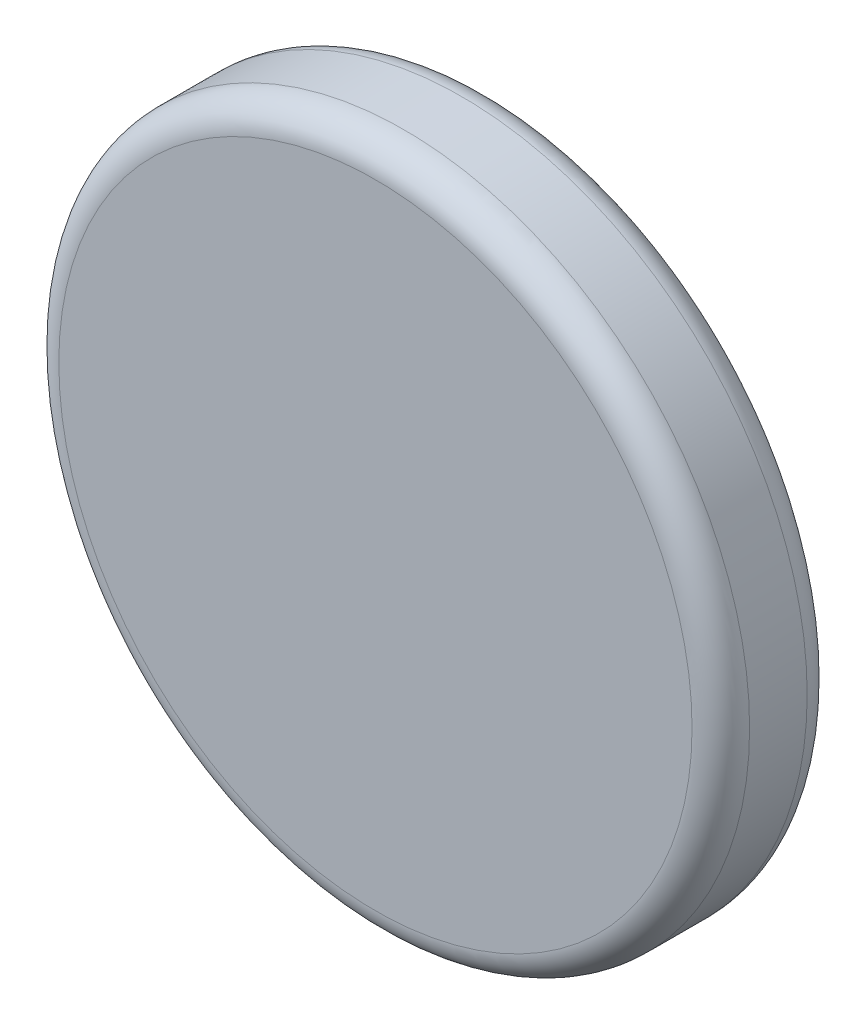
ISO-10303-21;
HEADER;
FILE_DESCRIPTION(('STEP AP214'),'2;1');
FILE_NAME('part.step','',(''),(''),'','','');
FILE_SCHEMA(('AUTOMOTIVE_DESIGN { 1 0 10303 214 1 1 1 1 }'));
ENDSEC;
DATA;
#1=APPLICATION_CONTEXT('core data for automotive mechanical design processes');
#2=APPLICATION_PROTOCOL_DEFINITION('international standard','automotive_design',2000,#1);
#3=PRODUCT_CONTEXT('',#1,'mechanical');
#4=PRODUCT('Part','Part','',(#3));
#5=PRODUCT_RELATED_PRODUCT_CATEGORY('part','',(#4));
#6=PRODUCT_DEFINITION_FORMATION('','',#4);
#7=PRODUCT_DEFINITION_CONTEXT('part definition',#1,'design');
#8=PRODUCT_DEFINITION('design','',#6,#7);
#9=PRODUCT_DEFINITION_SHAPE('','',#8);
#10=(LENGTH_UNIT() NAMED_UNIT(*) SI_UNIT(.MILLI.,.METRE.));
#11=(NAMED_UNIT(*) PLANE_ANGLE_UNIT() SI_UNIT($,.RADIAN.));
#12=(NAMED_UNIT(*) SI_UNIT($,.STERADIAN.) SOLID_ANGLE_UNIT());
#13=UNCERTAINTY_MEASURE_WITH_UNIT(LENGTH_MEASURE(1.E-05),#10,'distance_accuracy_value','');
#14=(GEOMETRIC_REPRESENTATION_CONTEXT(3) GLOBAL_UNCERTAINTY_ASSIGNED_CONTEXT((#13)) GLOBAL_UNIT_ASSIGNED_CONTEXT((#10,
#11,#12)) REPRESENTATION_CONTEXT('',''));
#15=CARTESIAN_POINT('',(0.,0.,0.));
#16=DIRECTION('',(0.,0.,1.));
#17=DIRECTION('',(1.,0.,0.));
#18=AXIS2_PLACEMENT_3D('',#15,#16,#17);
#19=CARTESIAN_POINT('',(0.,0.,40.));
#20=DIRECTION('',(0.,0.,-1.));
#21=DIRECTION('',(-1.,0.,0.));
#22=AXIS2_PLACEMENT_3D('',#19,#20,#21);
#23=CYLINDRICAL_SURFACE('',#22,120.);
#24=CARTESIAN_POINT('',(0.,0.,10.));
#25=DIRECTION('',(0.,0.,1.));
#26=DIRECTION('',(1.,0.,0.));
#27=AXIS2_PLACEMENT_3D('',#24,#25,#26);
#28=CIRCLE('',#27,120.);
#29=CARTESIAN_POINT('',(120.,0.,10.));
#30=VERTEX_POINT('',#29);
#31=EDGE_CURVE('E42',#30,#30,#28,.T.);
#32=ORIENTED_EDGE('',*,*,#31,.T.);
#33=EDGE_LOOP('',(#32));
#34=FACE_BOUND('',#33,.T.);
#35=CARTESIAN_POINT('',(0.,0.,30.));
#36=DIRECTION('',(0.,0.,1.));
#37=DIRECTION('',(1.,0.,0.));
#38=AXIS2_PLACEMENT_3D('',#35,#36,#37);
#39=CIRCLE('',#38,120.);
#40=CARTESIAN_POINT('',(120.,0.,30.));
#41=VERTEX_POINT('',#40);
#42=EDGE_CURVE('E46',#41,#41,#39,.F.);
#43=ORIENTED_EDGE('',*,*,#42,.T.);
#44=EDGE_LOOP('',(#43));
#45=FACE_BOUND('',#44,.T.);
#46=ADVANCED_FACE('F31',(#34,#45),#23,.T.);
#47=CARTESIAN_POINT('',(0.,0.,40.));
#48=DIRECTION('',(0.,0.,1.));
#49=DIRECTION('',(1.,0.,0.));
#50=AXIS2_PLACEMENT_3D('',#47,#48,#49);
#51=PLANE('',#50);
#52=CARTESIAN_POINT('',(0.,0.,40.));
#53=DIRECTION('',(0.,0.,1.));
#54=DIRECTION('',(1.,0.,0.));
#55=AXIS2_PLACEMENT_3D('',#52,#53,#54);
#56=CIRCLE('',#55,110.);
#57=CARTESIAN_POINT('',(110.,0.,40.));
#58=VERTEX_POINT('',#57);
#59=EDGE_CURVE('E10',#58,#58,#56,.T.);
#60=ORIENTED_EDGE('',*,*,#59,.T.);
#61=EDGE_LOOP('',(#60));
#62=FACE_BOUND('',#61,.T.);
#63=ADVANCED_FACE('F62',(#62),#51,.T.);
#64=CARTESIAN_POINT('',(0.,0.,0.));
#65=DIRECTION('',(0.,0.,1.));
#66=DIRECTION('',(1.,0.,0.));
#67=AXIS2_PLACEMENT_3D('',#64,#65,#66);
#68=PLANE('',#67);
#69=CARTESIAN_POINT('',(0.,0.,0.));
#70=DIRECTION('',(0.,0.,1.));
#71=DIRECTION('',(1.,0.,0.));
#72=AXIS2_PLACEMENT_3D('',#69,#70,#71);
#73=CIRCLE('',#72,110.);
#74=CARTESIAN_POINT('',(110.,0.,0.));
#75=VERTEX_POINT('',#74);
#76=EDGE_CURVE('E38',#75,#75,#73,.F.);
#77=ORIENTED_EDGE('',*,*,#76,.T.);
#78=EDGE_LOOP('',(#77));
#79=FACE_BOUND('',#78,.T.);
#80=ADVANCED_FACE('F59',(#79),#68,.F.);
#81=CARTESIAN_POINT('',(0.,0.,10.));
#82=DIRECTION('',(0.,0.,1.));
#83=DIRECTION('',(1.,0.,0.));
#84=AXIS2_PLACEMENT_3D('',#81,#82,#83);
#85=TOROIDAL_SURFACE('',#84,110.,10.);
#86=ORIENTED_EDGE('',*,*,#76,.F.);
#87=EDGE_LOOP('',(#86));
#88=FACE_BOUND('',#87,.T.);
#89=ORIENTED_EDGE('',*,*,#31,.F.);
#90=EDGE_LOOP('',(#89));
#91=FACE_BOUND('',#90,.T.);
#92=ADVANCED_FACE('F55',(#88,#91),#85,.T.);
#93=CARTESIAN_POINT('',(0.,0.,30.));
#94=DIRECTION('',(0.,0.,1.));
#95=DIRECTION('',(1.,0.,0.));
#96=AXIS2_PLACEMENT_3D('',#93,#94,#95);
#97=TOROIDAL_SURFACE('',#96,110.,10.);
#98=ORIENTED_EDGE('',*,*,#42,.F.);
#99=EDGE_LOOP('',(#98));
#100=FACE_BOUND('',#99,.T.);
#101=ORIENTED_EDGE('',*,*,#59,.F.);
#102=EDGE_LOOP('',(#101));
#103=FACE_BOUND('',#102,.T.);
#104=ADVANCED_FACE('F33',(#100,#103),#97,.T.);
#105=CLOSED_SHELL('',(#46,#63,#80,#92,#104));
#106=MANIFOLD_SOLID_BREP('B2',#105);
#107=ADVANCED_BREP_SHAPE_REPRESENTATION('',(#18,#106),#14);
#108=SHAPE_DEFINITION_REPRESENTATION(#9,#107);
ENDSEC;
END-ISO-10303-21;
